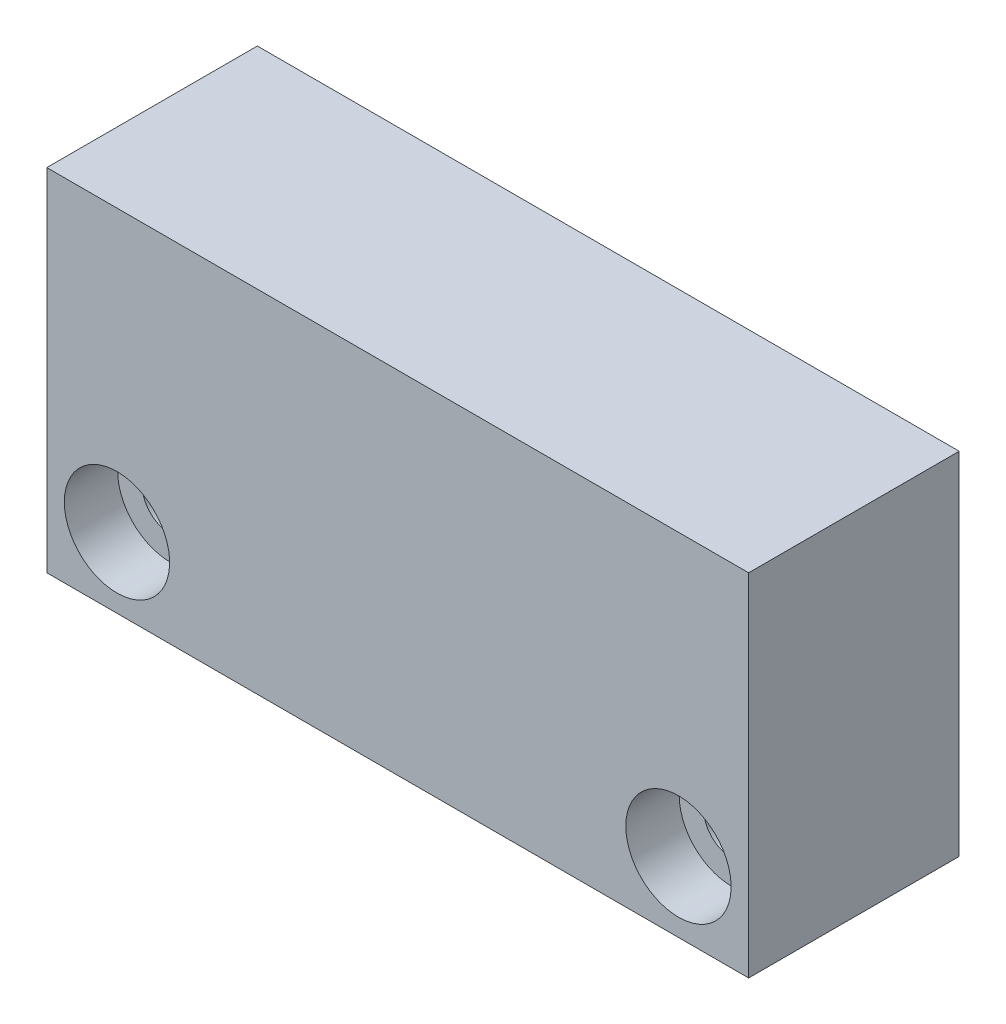
ISO-10303-21;
HEADER;
FILE_DESCRIPTION(('STEP AP214'),'2;1');
FILE_NAME('part.step','',(''),(''),'','','');
FILE_SCHEMA(('AUTOMOTIVE_DESIGN { 1 0 10303 214 1 1 1 1 }'));
ENDSEC;
DATA;
#1=APPLICATION_CONTEXT('core data for automotive mechanical design processes');
#2=APPLICATION_PROTOCOL_DEFINITION('international standard','automotive_design',2000,#1);
#3=PRODUCT_CONTEXT('',#1,'mechanical');
#4=PRODUCT('Part','Part','',(#3));
#5=PRODUCT_RELATED_PRODUCT_CATEGORY('part','',(#4));
#6=PRODUCT_DEFINITION_FORMATION('','',#4);
#7=PRODUCT_DEFINITION_CONTEXT('part definition',#1,'design');
#8=PRODUCT_DEFINITION('design','',#6,#7);
#9=PRODUCT_DEFINITION_SHAPE('','',#8);
#10=(LENGTH_UNIT() NAMED_UNIT(*) SI_UNIT(.MILLI.,.METRE.));
#11=(NAMED_UNIT(*) PLANE_ANGLE_UNIT() SI_UNIT($,.RADIAN.));
#12=(NAMED_UNIT(*) SI_UNIT($,.STERADIAN.) SOLID_ANGLE_UNIT());
#13=UNCERTAINTY_MEASURE_WITH_UNIT(LENGTH_MEASURE(1.E-05),#10,'distance_accuracy_value','');
#14=(GEOMETRIC_REPRESENTATION_CONTEXT(3) GLOBAL_UNCERTAINTY_ASSIGNED_CONTEXT((#13)) GLOBAL_UNIT_ASSIGNED_CONTEXT((#10,
#11,#12)) REPRESENTATION_CONTEXT('',''));
#15=CARTESIAN_POINT('',(0.,0.,0.));
#16=DIRECTION('',(0.,0.,1.));
#17=DIRECTION('',(1.,0.,0.));
#18=AXIS2_PLACEMENT_3D('',#15,#16,#17);
#19=CARTESIAN_POINT('',(35.8969387755102,0.,19.05));
#20=DIRECTION('',(1.,0.,0.));
#21=DIRECTION('',(0.,0.,-1.));
#22=AXIS2_PLACEMENT_3D('',#19,#20,#21);
#23=PLANE('',#22);
#24=DIRECTION('',(0.,-1.,0.));
#25=VECTOR('',#24,1.);
#26=CARTESIAN_POINT('',(35.8969387755102,0.,0.));
#27=LINE('',#26,#25);
#28=CARTESIAN_POINT('',(35.8969387755102,11.7280612244898,0.));
#29=VERTEX_POINT('',#28);
#30=CARTESIAN_POINT('',(35.8969387755102,-20.0219387755102,0.));
#31=VERTEX_POINT('',#30);
#32=EDGE_CURVE('E119',#29,#31,#27,.T.);
#33=ORIENTED_EDGE('',*,*,#32,.F.);
#34=DIRECTION('',(0.,0.,-1.));
#35=VECTOR('',#34,1.);
#36=CARTESIAN_POINT('',(35.8969387755102,11.7280612244898,19.05));
#37=LINE('',#36,#35);
#38=CARTESIAN_POINT('',(35.8969387755102,11.7280612244898,19.05));
#39=VERTEX_POINT('',#38);
#40=EDGE_CURVE('E86',#39,#29,#37,.T.);
#41=ORIENTED_EDGE('',*,*,#40,.F.);
#42=DIRECTION('',(0.,-1.,0.));
#43=VECTOR('',#42,1.);
#44=CARTESIAN_POINT('',(35.8969387755102,0.,19.05));
#45=LINE('',#44,#43);
#46=CARTESIAN_POINT('',(35.8969387755102,-20.0219387755102,19.05));
#47=VERTEX_POINT('',#46);
#48=EDGE_CURVE('E109',#39,#47,#45,.T.);
#49=ORIENTED_EDGE('',*,*,#48,.T.);
#50=DIRECTION('',(0.,0.,-1.));
#51=VECTOR('',#50,1.);
#52=CARTESIAN_POINT('',(35.8969387755102,-20.0219387755102,19.05));
#53=LINE('',#52,#51);
#54=EDGE_CURVE('E83',#47,#31,#53,.T.);
#55=ORIENTED_EDGE('',*,*,#54,.T.);
#56=EDGE_LOOP('',(#33,#41,#49,#55));
#57=FACE_BOUND('',#56,.T.);
#58=ADVANCED_FACE('F41',(#57),#23,.T.);
#59=CARTESIAN_POINT('',(0.,11.7280612244898,19.05));
#60=DIRECTION('',(0.,1.,0.));
#61=DIRECTION('',(0.,0.,1.));
#62=AXIS2_PLACEMENT_3D('',#59,#60,#61);
#63=PLANE('',#62);
#64=DIRECTION('',(1.,0.,0.));
#65=VECTOR('',#64,1.);
#66=CARTESIAN_POINT('',(0.,11.7280612244898,0.));
#67=LINE('',#66,#65);
#68=CARTESIAN_POINT('',(-27.6030612244898,11.7280612244898,0.));
#69=VERTEX_POINT('',#68);
#70=EDGE_CURVE('E97',#69,#29,#67,.T.);
#71=ORIENTED_EDGE('',*,*,#70,.F.);
#72=DIRECTION('',(0.,0.,-1.));
#73=VECTOR('',#72,1.);
#74=CARTESIAN_POINT('',(-27.6030612244898,11.7280612244898,19.05));
#75=LINE('',#74,#73);
#76=CARTESIAN_POINT('',(-27.6030612244898,11.7280612244898,19.05));
#77=VERTEX_POINT('',#76);
#78=EDGE_CURVE('E91',#77,#69,#75,.T.);
#79=ORIENTED_EDGE('',*,*,#78,.F.);
#80=DIRECTION('',(1.,0.,0.));
#81=VECTOR('',#80,1.);
#82=CARTESIAN_POINT('',(0.,11.7280612244898,19.05));
#83=LINE('',#82,#81);
#84=EDGE_CURVE('E95',#77,#39,#83,.T.);
#85=ORIENTED_EDGE('',*,*,#84,.T.);
#86=ORIENTED_EDGE('',*,*,#40,.T.);
#87=EDGE_LOOP('',(#71,#79,#85,#86));
#88=FACE_BOUND('',#87,.T.);
#89=ADVANCED_FACE('F93',(#88),#63,.T.);
#90=CARTESIAN_POINT('',(-27.6030612244898,0.,19.05));
#91=DIRECTION('',(1.,0.,0.));
#92=DIRECTION('',(0.,0.,-1.));
#93=AXIS2_PLACEMENT_3D('',#90,#91,#92);
#94=PLANE('',#93);
#95=DIRECTION('',(0.,-1.,0.));
#96=VECTOR('',#95,1.);
#97=CARTESIAN_POINT('',(-27.6030612244898,0.,0.));
#98=LINE('',#97,#96);
#99=CARTESIAN_POINT('',(-27.6030612244898,-20.0219387755102,0.));
#100=VERTEX_POINT('',#99);
#101=EDGE_CURVE('E125',#69,#100,#98,.T.);
#102=ORIENTED_EDGE('',*,*,#101,.T.);
#103=DIRECTION('',(0.,0.,-1.));
#104=VECTOR('',#103,1.);
#105=CARTESIAN_POINT('',(-27.6030612244898,-20.0219387755102,19.05));
#106=LINE('',#105,#104);
#107=CARTESIAN_POINT('',(-27.6030612244898,-20.0219387755102,19.05));
#108=VERTEX_POINT('',#107);
#109=EDGE_CURVE('E101',#108,#100,#106,.T.);
#110=ORIENTED_EDGE('',*,*,#109,.F.);
#111=DIRECTION('',(0.,-1.,0.));
#112=VECTOR('',#111,1.);
#113=CARTESIAN_POINT('',(-27.6030612244898,0.,19.05));
#114=LINE('',#113,#112);
#115=EDGE_CURVE('E104',#77,#108,#114,.T.);
#116=ORIENTED_EDGE('',*,*,#115,.F.);
#117=ORIENTED_EDGE('',*,*,#78,.T.);
#118=EDGE_LOOP('',(#102,#110,#116,#117));
#119=FACE_BOUND('',#118,.T.);
#120=ADVANCED_FACE('F105',(#119),#94,.F.);
#121=CARTESIAN_POINT('',(-21.2530612244898,-13.6719387755102,19.05));
#122=DIRECTION('',(0.,0.,-1.));
#123=DIRECTION('',(-1.,0.,0.));
#124=AXIS2_PLACEMENT_3D('',#121,#122,#123);
#125=CYLINDRICAL_SURFACE('',#124,4.7625);
#126=CARTESIAN_POINT('',(-21.2530612244898,-13.6719387755102,14.224));
#127=DIRECTION('',(0.,0.,1.));
#128=DIRECTION('',(1.,0.,0.));
#129=AXIS2_PLACEMENT_3D('',#126,#127,#128);
#130=CIRCLE('',#129,4.7625);
#131=CARTESIAN_POINT('',(-26.0155612244898,-13.6719387755102,14.224));
#132=VERTEX_POINT('',#131);
#133=EDGE_CURVE('E51',#132,#132,#130,.T.);
#134=CARTESIAN_POINT('',(-21.2530612244898,-13.6719387755102,19.05));
#135=DIRECTION('',(0.,0.,1.));
#136=DIRECTION('',(1.,0.,0.));
#137=AXIS2_PLACEMENT_3D('',#134,#135,#136);
#138=CIRCLE('',#137,4.7625);
#139=CARTESIAN_POINT('',(-26.0155612244898,-13.6719387755102,19.05));
#140=VERTEX_POINT('',#139);
#141=EDGE_CURVE('E113',#140,#140,#138,.T.);
#142=CARTESIAN_POINT('',(-26.0155612244898,-13.6719387755102,14.224));
#143=CARTESIAN_POINT('',(-26.0155612244898,-13.6719387755102,14.2742708333333));
#144=CARTESIAN_POINT('',(-26.0155612244898,-13.6719387755102,14.3245416666667));
#145=CARTESIAN_POINT('',(-26.0155612244898,-13.6719387755102,14.4250833333333));
#146=CARTESIAN_POINT('',(-26.0155612244898,-13.6719387755102,14.4753541666667));
#147=CARTESIAN_POINT('',(-26.0155612244898,-13.6719387755102,14.5758958333333));
#148=CARTESIAN_POINT('',(-26.0155612244898,-13.6719387755102,14.6261666666667));
#149=CARTESIAN_POINT('',(-26.0155612244898,-13.6719387755102,14.7267083333333));
#150=CARTESIAN_POINT('',(-26.0155612244898,-13.6719387755102,14.7769791666667));
#151=CARTESIAN_POINT('',(-26.0155612244898,-13.6719387755102,14.8775208333333));
#152=CARTESIAN_POINT('',(-26.0155612244898,-13.6719387755102,14.9277916666667));
#153=CARTESIAN_POINT('',(-26.0155612244898,-13.6719387755102,15.0283333333333));
#154=CARTESIAN_POINT('',(-26.0155612244898,-13.6719387755102,15.0786041666667));
#155=CARTESIAN_POINT('',(-26.0155612244898,-13.6719387755102,15.1791458333333));
#156=CARTESIAN_POINT('',(-26.0155612244898,-13.6719387755102,15.2294166666667));
#157=CARTESIAN_POINT('',(-26.0155612244898,-13.6719387755102,15.3299583333333));
#158=CARTESIAN_POINT('',(-26.0155612244898,-13.6719387755102,15.3802291666667));
#159=CARTESIAN_POINT('',(-26.0155612244898,-13.6719387755102,15.4807708333333));
#160=CARTESIAN_POINT('',(-26.0155612244898,-13.6719387755102,15.5310416666667));
#161=CARTESIAN_POINT('',(-26.0155612244898,-13.6719387755102,15.6315833333333));
#162=CARTESIAN_POINT('',(-26.0155612244898,-13.6719387755102,15.6818541666667));
#163=CARTESIAN_POINT('',(-26.0155612244898,-13.6719387755102,15.7823958333333));
#164=CARTESIAN_POINT('',(-26.0155612244898,-13.6719387755102,15.8326666666667));
#165=CARTESIAN_POINT('',(-26.0155612244898,-13.6719387755102,15.9332083333333));
#166=CARTESIAN_POINT('',(-26.0155612244898,-13.6719387755102,15.9834791666667));
#167=CARTESIAN_POINT('',(-26.0155612244898,-13.6719387755102,16.0840208333333));
#168=CARTESIAN_POINT('',(-26.0155612244898,-13.6719387755102,16.1342916666667));
#169=CARTESIAN_POINT('',(-26.0155612244898,-13.6719387755102,16.2348333333333));
#170=CARTESIAN_POINT('',(-26.0155612244898,-13.6719387755102,16.2851041666667));
#171=CARTESIAN_POINT('',(-26.0155612244898,-13.6719387755102,16.3856458333333));
#172=CARTESIAN_POINT('',(-26.0155612244898,-13.6719387755102,16.4359166666667));
#173=CARTESIAN_POINT('',(-26.0155612244898,-13.6719387755102,16.5364583333333));
#174=CARTESIAN_POINT('',(-26.0155612244898,-13.6719387755102,16.5867291666667));
#175=CARTESIAN_POINT('',(-26.0155612244898,-13.6719387755102,16.6872708333333));
#176=CARTESIAN_POINT('',(-26.0155612244898,-13.6719387755102,16.7375416666667));
#177=CARTESIAN_POINT('',(-26.0155612244898,-13.6719387755102,16.8380833333333));
#178=CARTESIAN_POINT('',(-26.0155612244898,-13.6719387755102,16.8883541666667));
#179=CARTESIAN_POINT('',(-26.0155612244898,-13.6719387755102,16.9888958333333));
#180=CARTESIAN_POINT('',(-26.0155612244898,-13.6719387755102,17.0391666666667));
#181=CARTESIAN_POINT('',(-26.0155612244898,-13.6719387755102,17.1397083333333));
#182=CARTESIAN_POINT('',(-26.0155612244898,-13.6719387755102,17.1899791666667));
#183=CARTESIAN_POINT('',(-26.0155612244898,-13.6719387755102,17.2905208333333));
#184=CARTESIAN_POINT('',(-26.0155612244898,-13.6719387755102,17.3407916666667));
#185=CARTESIAN_POINT('',(-26.0155612244898,-13.6719387755102,17.4413333333333));
#186=CARTESIAN_POINT('',(-26.0155612244898,-13.6719387755102,17.4916041666667));
#187=CARTESIAN_POINT('',(-26.0155612244898,-13.6719387755102,17.5921458333333));
#188=CARTESIAN_POINT('',(-26.0155612244898,-13.6719387755102,17.6424166666667));
#189=CARTESIAN_POINT('',(-26.0155612244898,-13.6719387755102,17.7429583333333));
#190=CARTESIAN_POINT('',(-26.0155612244898,-13.6719387755102,17.7932291666667));
#191=CARTESIAN_POINT('',(-26.0155612244898,-13.6719387755102,17.8937708333333));
#192=CARTESIAN_POINT('',(-26.0155612244898,-13.6719387755102,17.9440416666667));
#193=CARTESIAN_POINT('',(-26.0155612244898,-13.6719387755102,18.0445833333333));
#194=CARTESIAN_POINT('',(-26.0155612244898,-13.6719387755102,18.0948541666667));
#195=CARTESIAN_POINT('',(-26.0155612244898,-13.6719387755102,18.1953958333333));
#196=CARTESIAN_POINT('',(-26.0155612244898,-13.6719387755102,18.2456666666667));
#197=CARTESIAN_POINT('',(-26.0155612244898,-13.6719387755102,18.3462083333333));
#198=CARTESIAN_POINT('',(-26.0155612244898,-13.6719387755102,18.3964791666667));
#199=CARTESIAN_POINT('',(-26.0155612244898,-13.6719387755102,18.4970208333333));
#200=CARTESIAN_POINT('',(-26.0155612244898,-13.6719387755102,18.5472916666667));
#201=CARTESIAN_POINT('',(-26.0155612244898,-13.6719387755102,18.6478333333333));
#202=CARTESIAN_POINT('',(-26.0155612244898,-13.6719387755102,18.6981041666667));
#203=CARTESIAN_POINT('',(-26.0155612244898,-13.6719387755102,18.7986458333333));
#204=CARTESIAN_POINT('',(-26.0155612244898,-13.6719387755102,18.8489166666667));
#205=CARTESIAN_POINT('',(-26.0155612244898,-13.6719387755102,18.9494583333333));
#206=CARTESIAN_POINT('',(-26.0155612244898,-13.6719387755102,18.9997291666667));
#207=CARTESIAN_POINT('',(-26.0155612244898,-13.6719387755102,19.05));
#208=B_SPLINE_CURVE_WITH_KNOTS('',3,(#142,#143,#144,#145,#146,#147,#148,#149,#150,#151,#152,
#153,#154,#155,#156,#157,#158,#159,#160,#161,#162,#163,#164,#165,#166,#167,#168,#169,#170,#171,
#172,#173,#174,#175,#176,#177,#178,#179,#180,#181,#182,#183,#184,#185,#186,#187,#188,#189,#190,
#191,#192,#193,#194,#195,#196,#197,#198,#199,#200,#201,#202,#203,#204,#205,#206,#207),
.UNSPECIFIED.,.F.,.F.,(4,2,2,2,2,2,2,2,2,2,2,2,2,2,2,2,2,2,2,2,2,2,2,2,2,2,2,2,2,2,2,2,4),(0.,
0.1508125,0.301625,0.4524375,0.60325,0.7540625,0.904874999999999,1.0556875,1.2065,1.3573125,
1.508125,1.6589375,1.80975,1.9605625,2.111375,2.2621875,2.413,2.5638125,2.714625,2.8654375,
3.01625,3.1670625,3.317875,3.4686875,3.6195,3.7703125,3.921125,4.0719375,4.22275,4.3735625,
4.524375,4.6751875,4.826),.UNSPECIFIED.);
#209=EDGE_CURVE('BSEAM142',#132,#140,#208,.T.);
#210=ORIENTED_EDGE('',*,*,#133,.F.);
#211=ORIENTED_EDGE('',*,*,#141,.T.);
#212=ORIENTED_EDGE('',*,*,#209,.T.);
#213=ORIENTED_EDGE('',*,*,#209,.F.);
#214=EDGE_LOOP('',(#210,#212,#211,#213));
#215=FACE_BOUND('',#214,.T.);
#216=ADVANCED_FACE('F142',(#215),#125,.F.);
#217=CARTESIAN_POINT('',(29.5469387755102,-13.6719387755102,19.05));
#218=DIRECTION('',(0.,0.,-1.));
#219=DIRECTION('',(-1.,0.,0.));
#220=AXIS2_PLACEMENT_3D('',#217,#218,#219);
#221=CYLINDRICAL_SURFACE('',#220,4.76250000000001);
#222=CARTESIAN_POINT('',(29.5469387755102,-13.6719387755102,14.224));
#223=DIRECTION('',(0.,0.,1.));
#224=DIRECTION('',(1.,0.,0.));
#225=AXIS2_PLACEMENT_3D('',#222,#223,#224);
#226=CIRCLE('',#225,4.76250000000001);
#227=CARTESIAN_POINT('',(24.7844387755102,-13.6719387755102,14.224));
#228=VERTEX_POINT('',#227);
#229=EDGE_CURVE('E11',#228,#228,#226,.T.);
#230=CARTESIAN_POINT('',(29.5469387755102,-13.6719387755102,19.05));
#231=DIRECTION('',(0.,0.,1.));
#232=DIRECTION('',(1.,0.,0.));
#233=AXIS2_PLACEMENT_3D('',#230,#231,#232);
#234=CIRCLE('',#233,4.76250000000001);
#235=CARTESIAN_POINT('',(24.7844387755102,-13.6719387755102,19.05));
#236=VERTEX_POINT('',#235);
#237=EDGE_CURVE('E130',#236,#236,#234,.T.);
#238=CARTESIAN_POINT('',(24.7844387755102,-13.6719387755102,14.224));
#239=CARTESIAN_POINT('',(24.7844387755102,-13.6719387755102,14.2742708333333));
#240=CARTESIAN_POINT('',(24.7844387755102,-13.6719387755102,14.3245416666667));
#241=CARTESIAN_POINT('',(24.7844387755102,-13.6719387755102,14.4250833333333));
#242=CARTESIAN_POINT('',(24.7844387755102,-13.6719387755102,14.4753541666667));
#243=CARTESIAN_POINT('',(24.7844387755102,-13.6719387755102,14.5758958333333));
#244=CARTESIAN_POINT('',(24.7844387755102,-13.6719387755102,14.6261666666667));
#245=CARTESIAN_POINT('',(24.7844387755102,-13.6719387755102,14.7267083333333));
#246=CARTESIAN_POINT('',(24.7844387755102,-13.6719387755102,14.7769791666667));
#247=CARTESIAN_POINT('',(24.7844387755102,-13.6719387755102,14.8775208333333));
#248=CARTESIAN_POINT('',(24.7844387755102,-13.6719387755102,14.9277916666667));
#249=CARTESIAN_POINT('',(24.7844387755102,-13.6719387755102,15.0283333333333));
#250=CARTESIAN_POINT('',(24.7844387755102,-13.6719387755102,15.0786041666667));
#251=CARTESIAN_POINT('',(24.7844387755102,-13.6719387755102,15.1791458333333));
#252=CARTESIAN_POINT('',(24.7844387755102,-13.6719387755102,15.2294166666667));
#253=CARTESIAN_POINT('',(24.7844387755102,-13.6719387755102,15.3299583333333));
#254=CARTESIAN_POINT('',(24.7844387755102,-13.6719387755102,15.3802291666667));
#255=CARTESIAN_POINT('',(24.7844387755102,-13.6719387755102,15.4807708333333));
#256=CARTESIAN_POINT('',(24.7844387755102,-13.6719387755102,15.5310416666667));
#257=CARTESIAN_POINT('',(24.7844387755102,-13.6719387755102,15.6315833333333));
#258=CARTESIAN_POINT('',(24.7844387755102,-13.6719387755102,15.6818541666667));
#259=CARTESIAN_POINT('',(24.7844387755102,-13.6719387755102,15.7823958333333));
#260=CARTESIAN_POINT('',(24.7844387755102,-13.6719387755102,15.8326666666667));
#261=CARTESIAN_POINT('',(24.7844387755102,-13.6719387755102,15.9332083333333));
#262=CARTESIAN_POINT('',(24.7844387755102,-13.6719387755102,15.9834791666667));
#263=CARTESIAN_POINT('',(24.7844387755102,-13.6719387755102,16.0840208333333));
#264=CARTESIAN_POINT('',(24.7844387755102,-13.6719387755102,16.1342916666667));
#265=CARTESIAN_POINT('',(24.7844387755102,-13.6719387755102,16.2348333333333));
#266=CARTESIAN_POINT('',(24.7844387755102,-13.6719387755102,16.2851041666667));
#267=CARTESIAN_POINT('',(24.7844387755102,-13.6719387755102,16.3856458333333));
#268=CARTESIAN_POINT('',(24.7844387755102,-13.6719387755102,16.4359166666667));
#269=CARTESIAN_POINT('',(24.7844387755102,-13.6719387755102,16.5364583333333));
#270=CARTESIAN_POINT('',(24.7844387755102,-13.6719387755102,16.5867291666667));
#271=CARTESIAN_POINT('',(24.7844387755102,-13.6719387755102,16.6872708333333));
#272=CARTESIAN_POINT('',(24.7844387755102,-13.6719387755102,16.7375416666667));
#273=CARTESIAN_POINT('',(24.7844387755102,-13.6719387755102,16.8380833333333));
#274=CARTESIAN_POINT('',(24.7844387755102,-13.6719387755102,16.8883541666667));
#275=CARTESIAN_POINT('',(24.7844387755102,-13.6719387755102,16.9888958333333));
#276=CARTESIAN_POINT('',(24.7844387755102,-13.6719387755102,17.0391666666667));
#277=CARTESIAN_POINT('',(24.7844387755102,-13.6719387755102,17.1397083333333));
#278=CARTESIAN_POINT('',(24.7844387755102,-13.6719387755102,17.1899791666667));
#279=CARTESIAN_POINT('',(24.7844387755102,-13.6719387755102,17.2905208333333));
#280=CARTESIAN_POINT('',(24.7844387755102,-13.6719387755102,17.3407916666667));
#281=CARTESIAN_POINT('',(24.7844387755102,-13.6719387755102,17.4413333333333));
#282=CARTESIAN_POINT('',(24.7844387755102,-13.6719387755102,17.4916041666667));
#283=CARTESIAN_POINT('',(24.7844387755102,-13.6719387755102,17.5921458333333));
#284=CARTESIAN_POINT('',(24.7844387755102,-13.6719387755102,17.6424166666667));
#285=CARTESIAN_POINT('',(24.7844387755102,-13.6719387755102,17.7429583333333));
#286=CARTESIAN_POINT('',(24.7844387755102,-13.6719387755102,17.7932291666667));
#287=CARTESIAN_POINT('',(24.7844387755102,-13.6719387755102,17.8937708333333));
#288=CARTESIAN_POINT('',(24.7844387755102,-13.6719387755102,17.9440416666667));
#289=CARTESIAN_POINT('',(24.7844387755102,-13.6719387755102,18.0445833333333));
#290=CARTESIAN_POINT('',(24.7844387755102,-13.6719387755102,18.0948541666667));
#291=CARTESIAN_POINT('',(24.7844387755102,-13.6719387755102,18.1953958333333));
#292=CARTESIAN_POINT('',(24.7844387755102,-13.6719387755102,18.2456666666667));
#293=CARTESIAN_POINT('',(24.7844387755102,-13.6719387755102,18.3462083333333));
#294=CARTESIAN_POINT('',(24.7844387755102,-13.6719387755102,18.3964791666667));
#295=CARTESIAN_POINT('',(24.7844387755102,-13.6719387755102,18.4970208333333));
#296=CARTESIAN_POINT('',(24.7844387755102,-13.6719387755102,18.5472916666667));
#297=CARTESIAN_POINT('',(24.7844387755102,-13.6719387755102,18.6478333333333));
#298=CARTESIAN_POINT('',(24.7844387755102,-13.6719387755102,18.6981041666667));
#299=CARTESIAN_POINT('',(24.7844387755102,-13.6719387755102,18.7986458333333));
#300=CARTESIAN_POINT('',(24.7844387755102,-13.6719387755102,18.8489166666667));
#301=CARTESIAN_POINT('',(24.7844387755102,-13.6719387755102,18.9494583333333));
#302=CARTESIAN_POINT('',(24.7844387755102,-13.6719387755102,18.9997291666667));
#303=CARTESIAN_POINT('',(24.7844387755102,-13.6719387755102,19.05));
#304=B_SPLINE_CURVE_WITH_KNOTS('',3,(#238,#239,#240,#241,#242,#243,#244,#245,#246,#247,#248,
#249,#250,#251,#252,#253,#254,#255,#256,#257,#258,#259,#260,#261,#262,#263,#264,#265,#266,#267,
#268,#269,#270,#271,#272,#273,#274,#275,#276,#277,#278,#279,#280,#281,#282,#283,#284,#285,#286,
#287,#288,#289,#290,#291,#292,#293,#294,#295,#296,#297,#298,#299,#300,#301,#302,#303),
.UNSPECIFIED.,.F.,.F.,(4,2,2,2,2,2,2,2,2,2,2,2,2,2,2,2,2,2,2,2,2,2,2,2,2,2,2,2,2,2,2,2,4),(0.,
0.1508125,0.301625,0.4524375,0.60325,0.7540625,0.904874999999999,1.0556875,1.2065,1.3573125,
1.508125,1.6589375,1.80975,1.9605625,2.111375,2.2621875,2.413,2.5638125,2.714625,2.8654375,
3.01625,3.1670625,3.317875,3.4686875,3.6195,3.7703125,3.921125,4.0719375,4.22275,4.3735625,
4.524375,4.6751875,4.826),.UNSPECIFIED.);
#305=EDGE_CURVE('BSEAM43',#228,#236,#304,.T.);
#306=ORIENTED_EDGE('',*,*,#229,.F.);
#307=ORIENTED_EDGE('',*,*,#237,.T.);
#308=ORIENTED_EDGE('',*,*,#305,.T.);
#309=ORIENTED_EDGE('',*,*,#305,.F.);
#310=EDGE_LOOP('',(#306,#308,#307,#309));
#311=FACE_BOUND('',#310,.T.);
#312=ADVANCED_FACE('F43',(#311),#221,.F.);
#313=CARTESIAN_POINT('',(0.,-20.0219387755102,19.05));
#314=DIRECTION('',(0.,1.,0.));
#315=DIRECTION('',(-1.,0.,0.));
#316=AXIS2_PLACEMENT_3D('',#313,#314,#315);
#317=PLANE('',#316);
#318=DIRECTION('',(1.,0.,0.));
#319=VECTOR('',#318,1.);
#320=CARTESIAN_POINT('',(0.,-20.0219387755102,0.));
#321=LINE('',#320,#319);
#322=EDGE_CURVE('E76',#100,#31,#321,.T.);
#323=ORIENTED_EDGE('',*,*,#322,.T.);
#324=ORIENTED_EDGE('',*,*,#54,.F.);
#325=DIRECTION('',(1.,0.,0.));
#326=VECTOR('',#325,1.);
#327=CARTESIAN_POINT('',(0.,-20.0219387755102,19.05));
#328=LINE('',#327,#326);
#329=EDGE_CURVE('E59',#108,#47,#328,.T.);
#330=ORIENTED_EDGE('',*,*,#329,.F.);
#331=ORIENTED_EDGE('',*,*,#109,.T.);
#332=EDGE_LOOP('',(#323,#324,#330,#331));
#333=FACE_BOUND('',#332,.T.);
#334=ADVANCED_FACE('F180',(#333),#317,.F.);
#335=CARTESIAN_POINT('',(0.,0.,19.05));
#336=DIRECTION('',(0.,0.,1.));
#337=DIRECTION('',(1.,0.,0.));
#338=AXIS2_PLACEMENT_3D('',#335,#336,#337);
#339=PLANE('',#338);
#340=ORIENTED_EDGE('',*,*,#237,.F.);
#341=EDGE_LOOP('',(#340));
#342=FACE_BOUND('',#341,.T.);
#343=ORIENTED_EDGE('',*,*,#141,.F.);
#344=EDGE_LOOP('',(#343));
#345=FACE_BOUND('',#344,.T.);
#346=ORIENTED_EDGE('',*,*,#48,.F.);
#347=ORIENTED_EDGE('',*,*,#84,.F.);
#348=ORIENTED_EDGE('',*,*,#115,.T.);
#349=ORIENTED_EDGE('',*,*,#329,.T.);
#350=EDGE_LOOP('',(#346,#347,#348,#349));
#351=FACE_BOUND('',#350,.T.);
#352=ADVANCED_FACE('F108',(#342,#345,#351),#339,.T.);
#353=CARTESIAN_POINT('',(0.,0.,0.));
#354=DIRECTION('',(0.,0.,1.));
#355=DIRECTION('',(1.,0.,0.));
#356=AXIS2_PLACEMENT_3D('',#353,#354,#355);
#357=PLANE('',#356);
#358=ORIENTED_EDGE('',*,*,#32,.T.);
#359=ORIENTED_EDGE('',*,*,#322,.F.);
#360=ORIENTED_EDGE('',*,*,#101,.F.);
#361=ORIENTED_EDGE('',*,*,#70,.T.);
#362=EDGE_LOOP('',(#358,#359,#360,#361));
#363=FACE_BOUND('',#362,.T.);
#364=CARTESIAN_POINT('',(-21.2530612244898,-13.6719387755102,0.));
#365=DIRECTION('',(0.,0.,1.));
#366=DIRECTION('',(1.,0.,0.));
#367=AXIS2_PLACEMENT_3D('',#364,#365,#366);
#368=CIRCLE('',#367,2.5527);
#369=CARTESIAN_POINT('',(-18.7003612244898,-13.6719387755102,0.));
#370=VERTEX_POINT('',#369);
#371=EDGE_CURVE('E153',#370,#370,#368,.T.);
#372=ORIENTED_EDGE('',*,*,#371,.T.);
#373=EDGE_LOOP('',(#372));
#374=FACE_BOUND('',#373,.T.);
#375=CARTESIAN_POINT('',(29.5469387755102,-13.6719387755102,0.));
#376=DIRECTION('',(0.,0.,1.));
#377=DIRECTION('',(1.,0.,0.));
#378=AXIS2_PLACEMENT_3D('',#375,#376,#377);
#379=CIRCLE('',#378,2.5527);
#380=CARTESIAN_POINT('',(32.0996387755102,-13.6719387755102,0.));
#381=VERTEX_POINT('',#380);
#382=EDGE_CURVE('E161',#381,#381,#379,.T.);
#383=ORIENTED_EDGE('',*,*,#382,.T.);
#384=EDGE_LOOP('',(#383));
#385=FACE_BOUND('',#384,.T.);
#386=ADVANCED_FACE('F184',(#363,#374,#385),#357,.F.);
#387=CARTESIAN_POINT('',(-21.2530612244898,-13.6719387755102,14.224));
#388=DIRECTION('',(0.,0.,-1.));
#389=DIRECTION('',(-1.,0.,0.));
#390=AXIS2_PLACEMENT_3D('',#387,#388,#389);
#391=CYLINDRICAL_SURFACE('',#390,2.5527);
#392=CARTESIAN_POINT('',(-21.2530612244898,-13.6719387755102,14.224));
#393=DIRECTION('',(0.,0.,1.));
#394=DIRECTION('',(1.,0.,0.));
#395=AXIS2_PLACEMENT_3D('',#392,#393,#394);
#396=CIRCLE('',#395,2.5527);
#397=CARTESIAN_POINT('',(-18.7003612244898,-13.6719387755102,14.224));
#398=VERTEX_POINT('',#397);
#399=EDGE_CURVE('E122',#398,#398,#396,.T.);
#400=ORIENTED_EDGE('',*,*,#399,.T.);
#401=EDGE_LOOP('',(#400));
#402=FACE_BOUND('',#401,.T.);
#403=ORIENTED_EDGE('',*,*,#371,.F.);
#404=EDGE_LOOP('',(#403));
#405=FACE_BOUND('',#404,.T.);
#406=ADVANCED_FACE('F190',(#402,#405),#391,.F.);
#407=CARTESIAN_POINT('',(0.,0.,14.224));
#408=DIRECTION('',(0.,0.,1.));
#409=DIRECTION('',(1.,0.,0.));
#410=AXIS2_PLACEMENT_3D('',#407,#408,#409);
#411=PLANE('',#410);
#412=ORIENTED_EDGE('',*,*,#399,.F.);
#413=EDGE_LOOP('',(#412));
#414=FACE_BOUND('',#413,.T.);
#415=ORIENTED_EDGE('',*,*,#133,.T.);
#416=EDGE_LOOP('',(#415));
#417=FACE_BOUND('',#416,.T.);
#418=ADVANCED_FACE('F140',(#414,#417),#411,.T.);
#419=CARTESIAN_POINT('',(29.5469387755102,-13.6719387755102,14.224));
#420=DIRECTION('',(0.,0.,-1.));
#421=DIRECTION('',(-1.,0.,0.));
#422=AXIS2_PLACEMENT_3D('',#419,#420,#421);
#423=CYLINDRICAL_SURFACE('',#422,2.5527);
#424=CARTESIAN_POINT('',(29.5469387755102,-13.6719387755102,14.224));
#425=DIRECTION('',(0.,0.,1.));
#426=DIRECTION('',(1.,0.,0.));
#427=AXIS2_PLACEMENT_3D('',#424,#425,#426);
#428=CIRCLE('',#427,2.5527);
#429=CARTESIAN_POINT('',(32.0996387755102,-13.6719387755102,14.224));
#430=VERTEX_POINT('',#429);
#431=EDGE_CURVE('E157',#430,#430,#428,.T.);
#432=ORIENTED_EDGE('',*,*,#431,.T.);
#433=EDGE_LOOP('',(#432));
#434=FACE_BOUND('',#433,.T.);
#435=ORIENTED_EDGE('',*,*,#382,.F.);
#436=EDGE_LOOP('',(#435));
#437=FACE_BOUND('',#436,.T.);
#438=ADVANCED_FACE('F169',(#434,#437),#423,.F.);
#439=CARTESIAN_POINT('',(0.,0.,14.224));
#440=DIRECTION('',(0.,0.,1.));
#441=DIRECTION('',(1.,0.,0.));
#442=AXIS2_PLACEMENT_3D('',#439,#440,#441);
#443=PLANE('',#442);
#444=ORIENTED_EDGE('',*,*,#431,.F.);
#445=EDGE_LOOP('',(#444));
#446=FACE_BOUND('',#445,.T.);
#447=ORIENTED_EDGE('',*,*,#229,.T.);
#448=EDGE_LOOP('',(#447));
#449=FACE_BOUND('',#448,.T.);
#450=ADVANCED_FACE('F172',(#446,#449),#443,.T.);
#451=CLOSED_SHELL('',(#58,#89,#120,#216,#312,#334,#352,#386,#406,#418,#438,#450));
#452=MANIFOLD_SOLID_BREP('B2',#451);
#453=ADVANCED_BREP_SHAPE_REPRESENTATION('',(#18,#452),#14);
#454=SHAPE_DEFINITION_REPRESENTATION(#9,#453);
ENDSEC;
END-ISO-10303-21;
